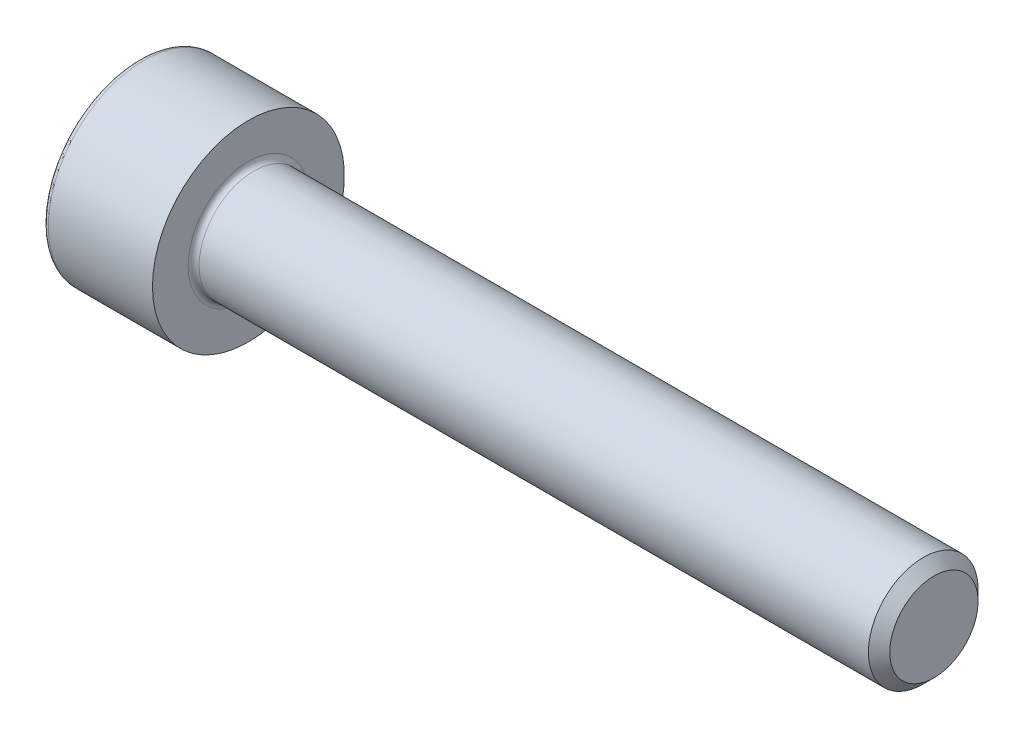
ISO-10303-21;
HEADER;
FILE_DESCRIPTION(('STEP AP214'),'2;1');
FILE_NAME('part.step','',(''),(''),'','','');
FILE_SCHEMA(('AUTOMOTIVE_DESIGN { 1 0 10303 214 1 1 1 1 }'));
ENDSEC;
DATA;
#1=APPLICATION_CONTEXT('core data for automotive mechanical design processes');
#2=APPLICATION_PROTOCOL_DEFINITION('international standard','automotive_design',2000,#1);
#3=PRODUCT_CONTEXT('',#1,'mechanical');
#4=PRODUCT('Part','Part','',(#3));
#5=PRODUCT_RELATED_PRODUCT_CATEGORY('part','',(#4));
#6=PRODUCT_DEFINITION_FORMATION('','',#4);
#7=PRODUCT_DEFINITION_CONTEXT('part definition',#1,'design');
#8=PRODUCT_DEFINITION('design','',#6,#7);
#9=PRODUCT_DEFINITION_SHAPE('','',#8);
#10=(LENGTH_UNIT() NAMED_UNIT(*) SI_UNIT(.MILLI.,.METRE.));
#11=(NAMED_UNIT(*) PLANE_ANGLE_UNIT() SI_UNIT($,.RADIAN.));
#12=(NAMED_UNIT(*) SI_UNIT($,.STERADIAN.) SOLID_ANGLE_UNIT());
#13=UNCERTAINTY_MEASURE_WITH_UNIT(LENGTH_MEASURE(1.E-05),#10,'distance_accuracy_value','');
#14=(GEOMETRIC_REPRESENTATION_CONTEXT(3) GLOBAL_UNCERTAINTY_ASSIGNED_CONTEXT((#13)) GLOBAL_UNIT_ASSIGNED_CONTEXT((#10,
#11,#12)) REPRESENTATION_CONTEXT('',''));
#15=CARTESIAN_POINT('',(0.,0.,0.));
#16=DIRECTION('',(0.,0.,1.));
#17=DIRECTION('',(1.,0.,0.));
#18=AXIS2_PLACEMENT_3D('',#15,#16,#17);
#19=CARTESIAN_POINT('',(2.,2.59807621135332,1.5));
#20=DIRECTION('',(1.,0.,0.));
#21=DIRECTION('',(0.,0.,-1.));
#22=AXIS2_PLACEMENT_3D('',#19,#20,#21);
#23=PLANE('',#22);
#24=CARTESIAN_POINT('',(2.,0.,0.));
#25=DIRECTION('',(1.,0.,0.));
#26=DIRECTION('',(0.,0.,-1.));
#27=AXIS2_PLACEMENT_3D('',#24,#25,#26);
#28=CIRCLE('',#27,1.5);
#29=CARTESIAN_POINT('',(2.,0.,-1.5));
#30=VERTEX_POINT('',#29);
#31=CARTESIAN_POINT('',(2.,-1.29903810567666,-0.749999999999999));
#32=VERTEX_POINT('',#31);
#33=EDGE_CURVE('E11',#30,#32,#28,.F.);
#34=ORIENTED_EDGE('',*,*,#33,.F.);
#35=DIRECTION('',(0.,1.,0.));
#36=VECTOR('',#35,1.);
#37=CARTESIAN_POINT('',(2.,-0.86602540378444,-1.5));
#38=LINE('',#37,#36);
#39=CARTESIAN_POINT('',(2.,-0.86602540378444,-1.5));
#40=VERTEX_POINT('',#39);
#41=EDGE_CURVE('E178',#40,#30,#38,.T.);
#42=ORIENTED_EDGE('',*,*,#41,.F.);
#43=DIRECTION('',(0.,0.5,-0.866025403784439));
#44=VECTOR('',#43,1.);
#45=CARTESIAN_POINT('',(2.,-1.73205080756888,0.));
#46=LINE('',#45,#44);
#47=EDGE_CURVE('E174',#32,#40,#46,.T.);
#48=ORIENTED_EDGE('',*,*,#47,.F.);
#49=EDGE_LOOP('',(#34,#42,#48));
#50=FACE_BOUND('',#49,.T.);
#51=ADVANCED_FACE('F34',(#50),#23,.F.);
#52=CARTESIAN_POINT('',(2.,-1.29903810567666,0.75));
#53=VERTEX_POINT('',#52);
#54=EDGE_CURVE('E43',#32,#53,#28,.F.);
#55=ORIENTED_EDGE('',*,*,#54,.F.);
#56=CARTESIAN_POINT('',(2.,-1.73205080756888,0.));
#57=VERTEX_POINT('',#56);
#58=EDGE_CURVE('E175',#57,#32,#46,.T.);
#59=ORIENTED_EDGE('',*,*,#58,.F.);
#60=DIRECTION('',(0.,-0.5,-0.866025403784439));
#61=VECTOR('',#60,1.);
#62=CARTESIAN_POINT('',(2.,-0.866025403784439,1.5));
#63=LINE('',#62,#61);
#64=EDGE_CURVE('E170',#53,#57,#63,.T.);
#65=ORIENTED_EDGE('',*,*,#64,.F.);
#66=EDGE_LOOP('',(#55,#59,#65));
#67=FACE_BOUND('',#66,.T.);
#68=ADVANCED_FACE('F118',(#67),#23,.F.);
#69=CARTESIAN_POINT('',(2.,0.,1.5));
#70=VERTEX_POINT('',#69);
#71=EDGE_CURVE('E254',#53,#70,#28,.F.);
#72=ORIENTED_EDGE('',*,*,#71,.F.);
#73=CARTESIAN_POINT('',(2.,-0.866025403784439,1.5));
#74=VERTEX_POINT('',#73);
#75=EDGE_CURVE('E171',#74,#53,#63,.T.);
#76=ORIENTED_EDGE('',*,*,#75,.F.);
#77=DIRECTION('',(0.,-1.,0.));
#78=VECTOR('',#77,1.);
#79=CARTESIAN_POINT('',(2.,0.866025403784439,1.5));
#80=LINE('',#79,#78);
#81=EDGE_CURVE('E166',#70,#74,#80,.T.);
#82=ORIENTED_EDGE('',*,*,#81,.F.);
#83=EDGE_LOOP('',(#72,#76,#82));
#84=FACE_BOUND('',#83,.T.);
#85=ADVANCED_FACE('F124',(#84),#23,.F.);
#86=CARTESIAN_POINT('',(2.,0.,0.));
#87=DIRECTION('',(-1.,0.,0.));
#88=DIRECTION('',(0.,0.,1.));
#89=AXIS2_PLACEMENT_3D('',#86,#87,#88);
#90=CIRCLE('',#89,1.5);
#91=CARTESIAN_POINT('',(2.,1.29903810567666,0.75));
#92=VERTEX_POINT('',#91);
#93=EDGE_CURVE('E164',#70,#92,#90,.T.);
#94=ORIENTED_EDGE('',*,*,#93,.F.);
#95=CARTESIAN_POINT('',(2.,0.866025403784439,1.5));
#96=VERTEX_POINT('',#95);
#97=EDGE_CURVE('E167',#96,#70,#80,.T.);
#98=ORIENTED_EDGE('',*,*,#97,.F.);
#99=DIRECTION('',(0.,-0.5,0.866025403784439));
#100=VECTOR('',#99,1.);
#101=CARTESIAN_POINT('',(2.,1.73205080756888,0.));
#102=LINE('',#101,#100);
#103=EDGE_CURVE('E161',#92,#96,#102,.T.);
#104=ORIENTED_EDGE('',*,*,#103,.F.);
#105=EDGE_LOOP('',(#94,#98,#104));
#106=FACE_BOUND('',#105,.T.);
#107=ADVANCED_FACE('F138',(#106),#23,.F.);
#108=CARTESIAN_POINT('',(2.,1.29903810567666,-0.75));
#109=VERTEX_POINT('',#108);
#110=EDGE_CURVE('E50',#92,#109,#28,.F.);
#111=ORIENTED_EDGE('',*,*,#110,.F.);
#112=CARTESIAN_POINT('',(2.,1.73205080756888,0.));
#113=VERTEX_POINT('',#112);
#114=EDGE_CURVE('E152',#113,#92,#102,.T.);
#115=ORIENTED_EDGE('',*,*,#114,.F.);
#116=DIRECTION('',(0.,0.5,0.866025403784439));
#117=VECTOR('',#116,1.);
#118=CARTESIAN_POINT('',(2.,0.866025403784439,-1.5));
#119=LINE('',#118,#117);
#120=EDGE_CURVE('E149',#109,#113,#119,.T.);
#121=ORIENTED_EDGE('',*,*,#120,.F.);
#122=EDGE_LOOP('',(#111,#115,#121));
#123=FACE_BOUND('',#122,.T.);
#124=ADVANCED_FACE('F129',(#123),#23,.F.);
#125=EDGE_CURVE('E38',#109,#30,#28,.F.);
#126=ORIENTED_EDGE('',*,*,#125,.F.);
#127=CARTESIAN_POINT('',(2.,0.866025403784439,-1.5));
#128=VERTEX_POINT('',#127);
#129=EDGE_CURVE('E144',#128,#109,#119,.T.);
#130=ORIENTED_EDGE('',*,*,#129,.F.);
#131=EDGE_CURVE('E145',#30,#128,#38,.T.);
#132=ORIENTED_EDGE('',*,*,#131,.F.);
#133=EDGE_LOOP('',(#126,#130,#132));
#134=FACE_BOUND('',#133,.T.);
#135=ADVANCED_FACE('F120',(#134),#23,.F.);
#136=CARTESIAN_POINT('',(0.,0.,0.));
#137=DIRECTION('',(1.,0.,0.));
#138=DIRECTION('',(0.,0.,-1.));
#139=AXIS2_PLACEMENT_3D('',#136,#137,#138);
#140=PLANE('',#139);
#141=CARTESIAN_POINT('',(0.,0.,0.));
#142=DIRECTION('',(1.,0.,0.));
#143=DIRECTION('',(0.,0.,-1.));
#144=AXIS2_PLACEMENT_3D('',#141,#142,#143);
#145=CIRCLE('',#144,3.3);
#146=CARTESIAN_POINT('',(0.,0.,-3.3));
#147=VERTEX_POINT('',#146);
#148=EDGE_CURVE('E221',#147,#147,#145,.F.);
#149=ORIENTED_EDGE('',*,*,#148,.T.);
#150=EDGE_LOOP('',(#149));
#151=FACE_BOUND('',#150,.T.);
#152=DIRECTION('',(0.,0.5,0.866025403784439));
#153=VECTOR('',#152,1.);
#154=CARTESIAN_POINT('',(0.,0.866025403784439,-1.5));
#155=LINE('',#154,#153);
#156=CARTESIAN_POINT('',(0.,0.866025403784439,-1.5));
#157=VERTEX_POINT('',#156);
#158=CARTESIAN_POINT('',(0.,1.73205080756888,0.));
#159=VERTEX_POINT('',#158);
#160=EDGE_CURVE('E180',#157,#159,#155,.T.);
#161=ORIENTED_EDGE('',*,*,#160,.T.);
#162=DIRECTION('',(0.,-0.5,0.866025403784439));
#163=VECTOR('',#162,1.);
#164=CARTESIAN_POINT('',(0.,1.73205080756888,0.));
#165=LINE('',#164,#163);
#166=CARTESIAN_POINT('',(0.,0.866025403784439,1.5));
#167=VERTEX_POINT('',#166);
#168=EDGE_CURVE('E182',#159,#167,#165,.T.);
#169=ORIENTED_EDGE('',*,*,#168,.T.);
#170=DIRECTION('',(0.,-1.,0.));
#171=VECTOR('',#170,1.);
#172=CARTESIAN_POINT('',(0.,0.866025403784439,1.5));
#173=LINE('',#172,#171);
#174=CARTESIAN_POINT('',(0.,-0.866025403784439,1.5));
#175=VERTEX_POINT('',#174);
#176=EDGE_CURVE('E184',#167,#175,#173,.T.);
#177=ORIENTED_EDGE('',*,*,#176,.T.);
#178=DIRECTION('',(0.,-0.5,-0.866025403784439));
#179=VECTOR('',#178,1.);
#180=CARTESIAN_POINT('',(0.,-0.866025403784439,1.5));
#181=LINE('',#180,#179);
#182=CARTESIAN_POINT('',(0.,-1.73205080756888,0.));
#183=VERTEX_POINT('',#182);
#184=EDGE_CURVE('E186',#175,#183,#181,.T.);
#185=ORIENTED_EDGE('',*,*,#184,.T.);
#186=DIRECTION('',(0.,0.5,-0.866025403784439));
#187=VECTOR('',#186,1.);
#188=CARTESIAN_POINT('',(0.,-1.73205080756888,0.));
#189=LINE('',#188,#187);
#190=CARTESIAN_POINT('',(0.,-0.86602540378444,-1.5));
#191=VERTEX_POINT('',#190);
#192=EDGE_CURVE('E188',#183,#191,#189,.T.);
#193=ORIENTED_EDGE('',*,*,#192,.T.);
#194=DIRECTION('',(0.,1.,0.));
#195=VECTOR('',#194,1.);
#196=CARTESIAN_POINT('',(0.,-0.86602540378444,-1.5));
#197=LINE('',#196,#195);
#198=EDGE_CURVE('E58',#191,#157,#197,.T.);
#199=ORIENTED_EDGE('',*,*,#198,.T.);
#200=EDGE_LOOP('',(#161,#169,#177,#185,#193,#199));
#201=FACE_BOUND('',#200,.T.);
#202=ADVANCED_FACE('F128',(#151,#201),#140,.F.);
#203=CARTESIAN_POINT('',(0.,0.,0.));
#204=DIRECTION('',(-1.,0.,0.));
#205=DIRECTION('',(0.,0.,1.));
#206=AXIS2_PLACEMENT_3D('',#203,#204,#205);
#207=CYLINDRICAL_SURFACE('',#206,3.5);
#208=CARTESIAN_POINT('',(0.2,0.,0.));
#209=DIRECTION('',(1.,0.,0.));
#210=DIRECTION('',(0.,0.,-1.));
#211=AXIS2_PLACEMENT_3D('',#208,#209,#210);
#212=CIRCLE('',#211,3.5);
#213=CARTESIAN_POINT('',(0.2,0.,-3.5));
#214=VERTEX_POINT('',#213);
#215=EDGE_CURVE('E147',#214,#214,#212,.T.);
#216=ORIENTED_EDGE('',*,*,#215,.T.);
#217=EDGE_LOOP('',(#216));
#218=FACE_BOUND('',#217,.T.);
#219=CARTESIAN_POINT('',(4.,0.,0.));
#220=DIRECTION('',(-1.,0.,0.));
#221=DIRECTION('',(0.,0.,1.));
#222=AXIS2_PLACEMENT_3D('',#219,#220,#221);
#223=CIRCLE('',#222,3.5);
#224=CARTESIAN_POINT('',(4.,0.,3.5));
#225=VERTEX_POINT('',#224);
#226=EDGE_CURVE('E212',#225,#225,#223,.T.);
#227=ORIENTED_EDGE('',*,*,#226,.T.);
#228=EDGE_LOOP('',(#227));
#229=FACE_BOUND('',#228,.T.);
#230=ADVANCED_FACE('F135',(#218,#229),#207,.T.);
#231=CARTESIAN_POINT('',(4.,3.5,0.));
#232=DIRECTION('',(-1.,0.,0.));
#233=DIRECTION('',(0.,0.,1.));
#234=AXIS2_PLACEMENT_3D('',#231,#232,#233);
#235=PLANE('',#234);
#236=CARTESIAN_POINT('',(4.,0.,0.));
#237=DIRECTION('',(-1.,0.,0.));
#238=DIRECTION('',(0.,0.,1.));
#239=AXIS2_PLACEMENT_3D('',#236,#237,#238);
#240=CIRCLE('',#239,2.2);
#241=CARTESIAN_POINT('',(4.,0.,2.2));
#242=VERTEX_POINT('',#241);
#243=EDGE_CURVE('E215',#242,#242,#240,.T.);
#244=ORIENTED_EDGE('',*,*,#243,.T.);
#245=EDGE_LOOP('',(#244));
#246=FACE_BOUND('',#245,.T.);
#247=ORIENTED_EDGE('',*,*,#226,.F.);
#248=EDGE_LOOP('',(#247));
#249=FACE_BOUND('',#248,.T.);
#250=ADVANCED_FACE('F363',(#246,#249),#235,.F.);
#251=CARTESIAN_POINT('',(0.,0.,0.));
#252=DIRECTION('',(-1.,0.,0.));
#253=DIRECTION('',(0.,0.,1.));
#254=AXIS2_PLACEMENT_3D('',#251,#252,#253);
#255=CYLINDRICAL_SURFACE('',#254,2.);
#256=CARTESIAN_POINT('',(4.2,0.,0.));
#257=DIRECTION('',(-1.,0.,0.));
#258=DIRECTION('',(0.,0.,1.));
#259=AXIS2_PLACEMENT_3D('',#256,#257,#258);
#260=CIRCLE('',#259,2.);
#261=CARTESIAN_POINT('',(4.2,0.,2.));
#262=VERTEX_POINT('',#261);
#263=EDGE_CURVE('E218',#262,#262,#260,.F.);
#264=ORIENTED_EDGE('',*,*,#263,.T.);
#265=EDGE_LOOP('',(#264));
#266=FACE_BOUND('',#265,.T.);
#267=CARTESIAN_POINT('',(28.61,0.,0.));
#268=DIRECTION('',(-1.,0.,0.));
#269=DIRECTION('',(0.,0.,1.));
#270=AXIS2_PLACEMENT_3D('',#267,#268,#269);
#271=CIRCLE('',#270,2.);
#272=CARTESIAN_POINT('',(28.61,0.,2.));
#273=VERTEX_POINT('',#272);
#274=EDGE_CURVE('E209',#273,#273,#271,.T.);
#275=ORIENTED_EDGE('',*,*,#274,.T.);
#276=EDGE_LOOP('',(#275));
#277=FACE_BOUND('',#276,.T.);
#278=ADVANCED_FACE('F379',(#266,#277),#255,.T.);
#279=CARTESIAN_POINT('',(29.,0.,0.));
#280=DIRECTION('',(-1.,0.,0.));
#281=DIRECTION('',(0.,0.,1.));
#282=AXIS2_PLACEMENT_3D('',#279,#280,#281);
#283=CONICAL_SURFACE('',#282,1.61,0.785398163397451);
#284=ORIENTED_EDGE('',*,*,#274,.F.);
#285=EDGE_LOOP('',(#284));
#286=FACE_BOUND('',#285,.T.);
#287=CARTESIAN_POINT('',(29.,0.,0.));
#288=DIRECTION('',(-1.,0.,0.));
#289=DIRECTION('',(0.,0.,1.));
#290=AXIS2_PLACEMENT_3D('',#287,#288,#289);
#291=CIRCLE('',#290,1.61);
#292=CARTESIAN_POINT('',(29.,0.,1.61));
#293=VERTEX_POINT('',#292);
#294=EDGE_CURVE('E206',#293,#293,#291,.T.);
#295=ORIENTED_EDGE('',*,*,#294,.T.);
#296=EDGE_LOOP('',(#295));
#297=FACE_BOUND('',#296,.T.);
#298=ADVANCED_FACE('F384',(#286,#297),#283,.T.);
#299=CARTESIAN_POINT('',(29.,1.61,0.));
#300=DIRECTION('',(-1.,0.,0.));
#301=DIRECTION('',(0.,0.,1.));
#302=AXIS2_PLACEMENT_3D('',#299,#300,#301);
#303=PLANE('',#302);
#304=ORIENTED_EDGE('',*,*,#294,.F.);
#305=EDGE_LOOP('',(#304));
#306=FACE_BOUND('',#305,.T.);
#307=ADVANCED_FACE('F372',(#306),#303,.F.);
#308=CARTESIAN_POINT('',(4.2,0.,0.));
#309=DIRECTION('',(-1.,0.,0.));
#310=DIRECTION('',(0.,0.,1.));
#311=AXIS2_PLACEMENT_3D('',#308,#309,#310);
#312=TOROIDAL_SURFACE('',#311,2.2,0.2);
#313=ORIENTED_EDGE('',*,*,#263,.F.);
#314=EDGE_LOOP('',(#313));
#315=FACE_BOUND('',#314,.T.);
#316=ORIENTED_EDGE('',*,*,#243,.F.);
#317=EDGE_LOOP('',(#316));
#318=FACE_BOUND('',#317,.T.);
#319=ADVANCED_FACE('F230',(#315,#318),#312,.F.);
#320=CARTESIAN_POINT('',(0.2,0.,0.));
#321=DIRECTION('',(1.,0.,0.));
#322=DIRECTION('',(0.,0.,-1.));
#323=AXIS2_PLACEMENT_3D('',#320,#321,#322);
#324=TOROIDAL_SURFACE('',#323,3.3,0.2);
#325=ORIENTED_EDGE('',*,*,#215,.F.);
#326=EDGE_LOOP('',(#325));
#327=FACE_BOUND('',#326,.T.);
#328=ORIENTED_EDGE('',*,*,#148,.F.);
#329=EDGE_LOOP('',(#328));
#330=FACE_BOUND('',#329,.T.);
#331=ADVANCED_FACE('F36',(#327,#330),#324,.T.);
#332=CARTESIAN_POINT('',(2.,0.866025403784439,-1.5));
#333=DIRECTION('',(0.,-0.866025403784439,0.5));
#334=DIRECTION('',(0.,-0.5,-0.866025403784439));
#335=AXIS2_PLACEMENT_3D('',#332,#333,#334);
#336=PLANE('',#335);
#337=ORIENTED_EDGE('',*,*,#129,.T.);
#338=ORIENTED_EDGE('',*,*,#120,.T.);
#339=DIRECTION('',(-1.,0.,0.));
#340=VECTOR('',#339,1.);
#341=CARTESIAN_POINT('',(2.,1.73205080756888,0.));
#342=LINE('',#341,#340);
#343=EDGE_CURVE('E204',#113,#159,#342,.T.);
#344=ORIENTED_EDGE('',*,*,#343,.T.);
#345=ORIENTED_EDGE('',*,*,#160,.F.);
#346=DIRECTION('',(-1.,0.,0.));
#347=VECTOR('',#346,1.);
#348=CARTESIAN_POINT('',(2.,0.866025403784439,-1.5));
#349=LINE('',#348,#347);
#350=EDGE_CURVE('E160',#128,#157,#349,.T.);
#351=ORIENTED_EDGE('',*,*,#350,.F.);
#352=EDGE_LOOP('',(#337,#338,#344,#345,#351));
#353=FACE_BOUND('',#352,.T.);
#354=ADVANCED_FACE('F158',(#353),#336,.T.);
#355=CARTESIAN_POINT('',(2.,1.73205080756888,0.));
#356=DIRECTION('',(0.,-0.866025403784439,-0.5));
#357=DIRECTION('',(0.,0.5,-0.866025403784439));
#358=AXIS2_PLACEMENT_3D('',#355,#356,#357);
#359=PLANE('',#358);
#360=ORIENTED_EDGE('',*,*,#114,.T.);
#361=ORIENTED_EDGE('',*,*,#103,.T.);
#362=DIRECTION('',(-1.,0.,0.));
#363=VECTOR('',#362,1.);
#364=CARTESIAN_POINT('',(2.,0.866025403784439,1.5));
#365=LINE('',#364,#363);
#366=EDGE_CURVE('E201',#96,#167,#365,.T.);
#367=ORIENTED_EDGE('',*,*,#366,.T.);
#368=ORIENTED_EDGE('',*,*,#168,.F.);
#369=ORIENTED_EDGE('',*,*,#343,.F.);
#370=EDGE_LOOP('',(#360,#361,#367,#368,#369));
#371=FACE_BOUND('',#370,.T.);
#372=ADVANCED_FACE('F234',(#371),#359,.T.);
#373=CARTESIAN_POINT('',(2.,0.866025403784439,1.5));
#374=DIRECTION('',(0.,0.,-1.));
#375=DIRECTION('',(-1.,0.,0.));
#376=AXIS2_PLACEMENT_3D('',#373,#374,#375);
#377=PLANE('',#376);
#378=ORIENTED_EDGE('',*,*,#97,.T.);
#379=ORIENTED_EDGE('',*,*,#81,.T.);
#380=DIRECTION('',(-1.,0.,0.));
#381=VECTOR('',#380,1.);
#382=CARTESIAN_POINT('',(2.,-0.866025403784439,1.5));
#383=LINE('',#382,#381);
#384=EDGE_CURVE('E198',#74,#175,#383,.T.);
#385=ORIENTED_EDGE('',*,*,#384,.T.);
#386=ORIENTED_EDGE('',*,*,#176,.F.);
#387=ORIENTED_EDGE('',*,*,#366,.F.);
#388=EDGE_LOOP('',(#378,#379,#385,#386,#387));
#389=FACE_BOUND('',#388,.T.);
#390=ADVANCED_FACE('F239',(#389),#377,.T.);
#391=CARTESIAN_POINT('',(2.,-0.866025403784439,1.5));
#392=DIRECTION('',(0.,0.866025403784439,-0.5));
#393=DIRECTION('',(0.,0.5,0.866025403784439));
#394=AXIS2_PLACEMENT_3D('',#391,#392,#393);
#395=PLANE('',#394);
#396=ORIENTED_EDGE('',*,*,#75,.T.);
#397=ORIENTED_EDGE('',*,*,#64,.T.);
#398=DIRECTION('',(-1.,0.,0.));
#399=VECTOR('',#398,1.);
#400=CARTESIAN_POINT('',(2.,-1.73205080756888,0.));
#401=LINE('',#400,#399);
#402=EDGE_CURVE('E195',#57,#183,#401,.T.);
#403=ORIENTED_EDGE('',*,*,#402,.T.);
#404=ORIENTED_EDGE('',*,*,#184,.F.);
#405=ORIENTED_EDGE('',*,*,#384,.F.);
#406=EDGE_LOOP('',(#396,#397,#403,#404,#405));
#407=FACE_BOUND('',#406,.T.);
#408=ADVANCED_FACE('F245',(#407),#395,.T.);
#409=CARTESIAN_POINT('',(2.,-1.73205080756888,0.));
#410=DIRECTION('',(0.,0.866025403784439,0.5));
#411=DIRECTION('',(0.,-0.5,0.866025403784439));
#412=AXIS2_PLACEMENT_3D('',#409,#410,#411);
#413=PLANE('',#412);
#414=ORIENTED_EDGE('',*,*,#58,.T.);
#415=ORIENTED_EDGE('',*,*,#47,.T.);
#416=DIRECTION('',(-1.,0.,0.));
#417=VECTOR('',#416,1.);
#418=CARTESIAN_POINT('',(2.,-0.86602540378444,-1.5));
#419=LINE('',#418,#417);
#420=EDGE_CURVE('E192',#40,#191,#419,.T.);
#421=ORIENTED_EDGE('',*,*,#420,.T.);
#422=ORIENTED_EDGE('',*,*,#192,.F.);
#423=ORIENTED_EDGE('',*,*,#402,.F.);
#424=EDGE_LOOP('',(#414,#415,#421,#422,#423));
#425=FACE_BOUND('',#424,.T.);
#426=ADVANCED_FACE('F113',(#425),#413,.T.);
#427=CARTESIAN_POINT('',(2.,-0.86602540378444,-1.5));
#428=DIRECTION('',(0.,0.,1.));
#429=DIRECTION('',(1.,0.,0.));
#430=AXIS2_PLACEMENT_3D('',#427,#428,#429);
#431=PLANE('',#430);
#432=ORIENTED_EDGE('',*,*,#41,.T.);
#433=ORIENTED_EDGE('',*,*,#131,.T.);
#434=ORIENTED_EDGE('',*,*,#350,.T.);
#435=ORIENTED_EDGE('',*,*,#198,.F.);
#436=ORIENTED_EDGE('',*,*,#420,.F.);
#437=EDGE_LOOP('',(#432,#433,#434,#435,#436));
#438=FACE_BOUND('',#437,.T.);
#439=ADVANCED_FACE('F108',(#438),#431,.T.);
#440=CARTESIAN_POINT('',(2.86602540378445,0.,0.));
#441=DIRECTION('',(-1.,0.,0.));
#442=DIRECTION('',(0.,0.,1.));
#443=AXIS2_PLACEMENT_3D('',#440,#441,#442);
#444=CONICAL_SURFACE('',#443,0.,1.04719755119659);
#445=ORIENTED_EDGE('',*,*,#93,.T.);
#446=ORIENTED_EDGE('',*,*,#110,.T.);
#447=ORIENTED_EDGE('',*,*,#125,.T.);
#448=ORIENTED_EDGE('',*,*,#33,.T.);
#449=ORIENTED_EDGE('',*,*,#54,.T.);
#450=ORIENTED_EDGE('',*,*,#71,.T.);
#451=EDGE_LOOP('',(#445,#446,#447,#448,#449,#450));
#452=FACE_BOUND('',#451,.T.);
#453=CARTESIAN_POINT('',(2.86602540378445,0.,0.));
#454=VERTEX_POINT('',#453);
#455=VERTEX_LOOP('',#454);
#456=FACE_BOUND('',#455,.T.);
#457=ADVANCED_FACE('F106',(#452,#456),#444,.F.);
#458=CLOSED_SHELL('',(#51,#68,#85,#107,#124,#135,#202,#230,#250,#278,#298,#307,#319,#331,#354,
#372,#390,#408,#426,#439,#457));
#459=MANIFOLD_SOLID_BREP('B2',#458);
#460=ADVANCED_BREP_SHAPE_REPRESENTATION('',(#18,#459),#14);
#461=SHAPE_DEFINITION_REPRESENTATION(#9,#460);
ENDSEC;
END-ISO-10303-21;
